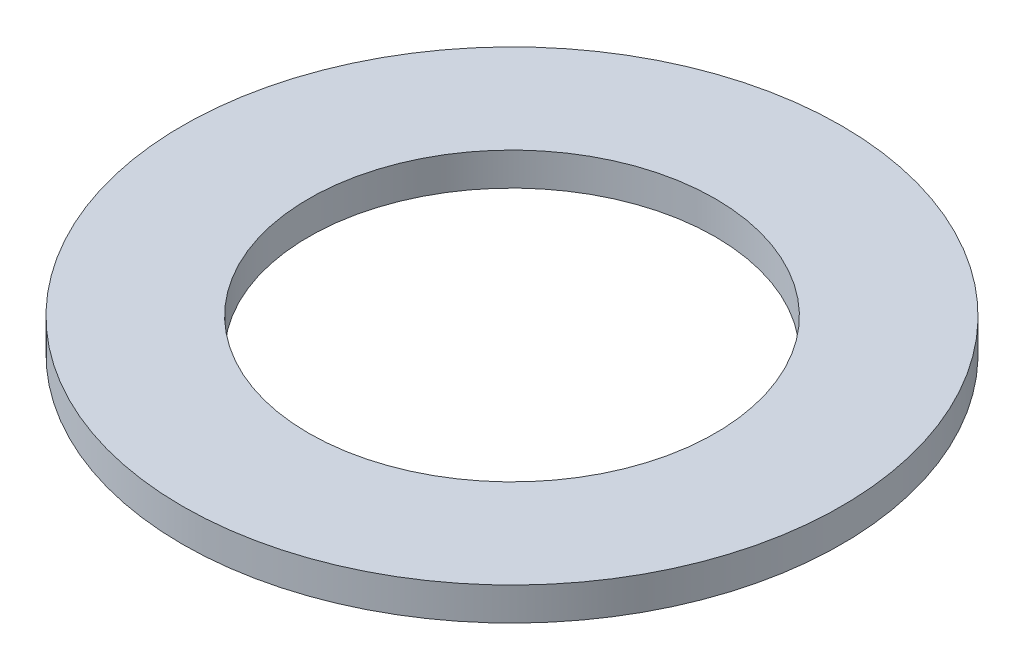
ISO-10303-21;
HEADER;
FILE_DESCRIPTION(('STEP AP214'),'2;1');
FILE_NAME('part.step','',(''),(''),'','','');
FILE_SCHEMA(('AUTOMOTIVE_DESIGN { 1 0 10303 214 1 1 1 1 }'));
ENDSEC;
DATA;
#1=APPLICATION_CONTEXT('core data for automotive mechanical design processes');
#2=APPLICATION_PROTOCOL_DEFINITION('international standard','automotive_design',2000,#1);
#3=PRODUCT_CONTEXT('',#1,'mechanical');
#4=PRODUCT('Part','Part','',(#3));
#5=PRODUCT_RELATED_PRODUCT_CATEGORY('part','',(#4));
#6=PRODUCT_DEFINITION_FORMATION('','',#4);
#7=PRODUCT_DEFINITION_CONTEXT('part definition',#1,'design');
#8=PRODUCT_DEFINITION('design','',#6,#7);
#9=PRODUCT_DEFINITION_SHAPE('','',#8);
#10=(LENGTH_UNIT() NAMED_UNIT(*) SI_UNIT(.MILLI.,.METRE.));
#11=(NAMED_UNIT(*) PLANE_ANGLE_UNIT() SI_UNIT($,.RADIAN.));
#12=(NAMED_UNIT(*) SI_UNIT($,.STERADIAN.) SOLID_ANGLE_UNIT());
#13=UNCERTAINTY_MEASURE_WITH_UNIT(LENGTH_MEASURE(1.E-05),#10,'distance_accuracy_value','');
#14=(GEOMETRIC_REPRESENTATION_CONTEXT(3) GLOBAL_UNCERTAINTY_ASSIGNED_CONTEXT((#13)) GLOBAL_UNIT_ASSIGNED_CONTEXT((#10,
#11,#12)) REPRESENTATION_CONTEXT('',''));
#15=CARTESIAN_POINT('',(0.,0.,0.));
#16=DIRECTION('',(0.,0.,1.));
#17=DIRECTION('',(1.,0.,0.));
#18=AXIS2_PLACEMENT_3D('',#15,#16,#17);
#19=CARTESIAN_POINT('',(0.,0.75,0.));
#20=DIRECTION('',(0.,1.,0.));
#21=DIRECTION('',(0.,0.,1.));
#22=AXIS2_PLACEMENT_3D('',#19,#20,#21);
#23=PLANE('',#22);
#24=CARTESIAN_POINT('',(0.,0.75,0.));
#25=DIRECTION('',(0.,1.,0.));
#26=DIRECTION('',(0.,0.,1.));
#27=AXIS2_PLACEMENT_3D('',#24,#25,#26);
#28=CIRCLE('',#27,15.);
#29=CARTESIAN_POINT('',(0.,0.75,15.));
#30=VERTEX_POINT('',#29);
#31=EDGE_CURVE('E10',#30,#30,#28,.T.);
#32=ORIENTED_EDGE('',*,*,#31,.T.);
#33=EDGE_LOOP('',(#32));
#34=FACE_BOUND('',#33,.T.);
#35=CARTESIAN_POINT('',(0.,0.75,0.));
#36=DIRECTION('',(0.,1.,0.));
#37=DIRECTION('',(0.,0.,1.));
#38=AXIS2_PLACEMENT_3D('',#35,#36,#37);
#39=CIRCLE('',#38,9.25);
#40=CARTESIAN_POINT('',(0.,0.75,9.25));
#41=VERTEX_POINT('',#40);
#42=EDGE_CURVE('E46',#41,#41,#39,.T.);
#43=ORIENTED_EDGE('',*,*,#42,.F.);
#44=EDGE_LOOP('',(#43));
#45=FACE_BOUND('',#44,.T.);
#46=ADVANCED_FACE('F35',(#34,#45),#23,.T.);
#47=CARTESIAN_POINT('',(0.,-0.75,0.));
#48=DIRECTION('',(0.,1.,0.));
#49=DIRECTION('',(0.,0.,1.));
#50=AXIS2_PLACEMENT_3D('',#47,#48,#49);
#51=PLANE('',#50);
#52=CARTESIAN_POINT('',(0.,-0.75,0.));
#53=DIRECTION('',(0.,1.,0.));
#54=DIRECTION('',(0.,0.,1.));
#55=AXIS2_PLACEMENT_3D('',#52,#53,#54);
#56=CIRCLE('',#55,15.);
#57=CARTESIAN_POINT('',(0.,-0.75,15.));
#58=VERTEX_POINT('',#57);
#59=EDGE_CURVE('E39',#58,#58,#56,.T.);
#60=ORIENTED_EDGE('',*,*,#59,.F.);
#61=EDGE_LOOP('',(#60));
#62=FACE_BOUND('',#61,.T.);
#63=CARTESIAN_POINT('',(0.,-0.75,0.));
#64=DIRECTION('',(0.,1.,0.));
#65=DIRECTION('',(0.,0.,1.));
#66=AXIS2_PLACEMENT_3D('',#63,#64,#65);
#67=CIRCLE('',#66,9.25);
#68=CARTESIAN_POINT('',(0.,-0.75,9.25));
#69=VERTEX_POINT('',#68);
#70=EDGE_CURVE('E48',#69,#69,#67,.T.);
#71=ORIENTED_EDGE('',*,*,#70,.T.);
#72=EDGE_LOOP('',(#71));
#73=FACE_BOUND('',#72,.T.);
#74=ADVANCED_FACE('F58',(#62,#73),#51,.F.);
#75=CARTESIAN_POINT('',(0.,0.75,0.));
#76=DIRECTION('',(0.,-1.,0.));
#77=DIRECTION('',(0.,0.,-1.));
#78=AXIS2_PLACEMENT_3D('',#75,#76,#77);
#79=CYLINDRICAL_SURFACE('',#78,15.);
#80=ORIENTED_EDGE('',*,*,#31,.F.);
#81=EDGE_LOOP('',(#80));
#82=FACE_BOUND('',#81,.T.);
#83=ORIENTED_EDGE('',*,*,#59,.T.);
#84=EDGE_LOOP('',(#83));
#85=FACE_BOUND('',#84,.T.);
#86=ADVANCED_FACE('F37',(#82,#85),#79,.T.);
#87=CARTESIAN_POINT('',(0.,0.75,0.));
#88=DIRECTION('',(0.,-1.,0.));
#89=DIRECTION('',(0.,0.,-1.));
#90=AXIS2_PLACEMENT_3D('',#87,#88,#89);
#91=CYLINDRICAL_SURFACE('',#90,9.25);
#92=ORIENTED_EDGE('',*,*,#42,.T.);
#93=EDGE_LOOP('',(#92));
#94=FACE_BOUND('',#93,.T.);
#95=ORIENTED_EDGE('',*,*,#70,.F.);
#96=EDGE_LOOP('',(#95));
#97=FACE_BOUND('',#96,.T.);
#98=ADVANCED_FACE('F54',(#94,#97),#91,.F.);
#99=CLOSED_SHELL('',(#46,#74,#86,#98));
#100=MANIFOLD_SOLID_BREP('B2',#99);
#101=ADVANCED_BREP_SHAPE_REPRESENTATION('',(#18,#100),#14);
#102=SHAPE_DEFINITION_REPRESENTATION(#9,#101);
ENDSEC;
END-ISO-10303-21;
